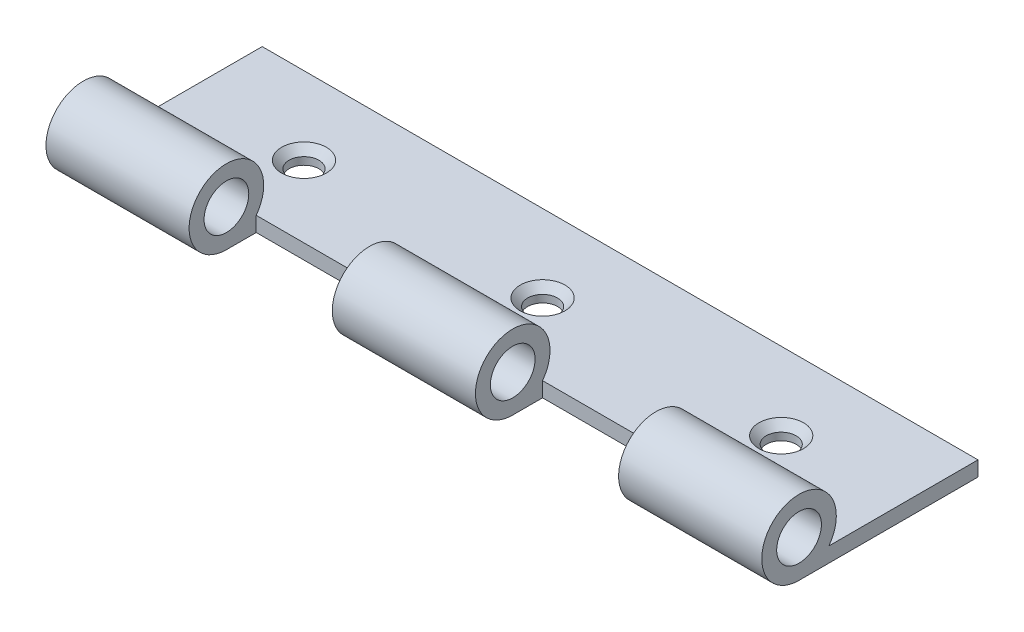
ISO-10303-21;
HEADER;
FILE_DESCRIPTION(('STEP AP214'),'2;1');
FILE_NAME('part.step','',(''),(''),'','','');
FILE_SCHEMA(('AUTOMOTIVE_DESIGN { 1 0 10303 214 1 1 1 1 }'));
ENDSEC;
DATA;
#1=APPLICATION_CONTEXT('core data for automotive mechanical design processes');
#2=APPLICATION_PROTOCOL_DEFINITION('international standard','automotive_design',2000,#1);
#3=PRODUCT_CONTEXT('',#1,'mechanical');
#4=PRODUCT('Part','Part','',(#3));
#5=PRODUCT_RELATED_PRODUCT_CATEGORY('part','',(#4));
#6=PRODUCT_DEFINITION_FORMATION('','',#4);
#7=PRODUCT_DEFINITION_CONTEXT('part definition',#1,'design');
#8=PRODUCT_DEFINITION('design','',#6,#7);
#9=PRODUCT_DEFINITION_SHAPE('','',#8);
#10=(LENGTH_UNIT() NAMED_UNIT(*) SI_UNIT(.MILLI.,.METRE.));
#11=(NAMED_UNIT(*) PLANE_ANGLE_UNIT() SI_UNIT($,.RADIAN.));
#12=(NAMED_UNIT(*) SI_UNIT($,.STERADIAN.) SOLID_ANGLE_UNIT());
#13=UNCERTAINTY_MEASURE_WITH_UNIT(LENGTH_MEASURE(1.E-05),#10,'distance_accuracy_value','');
#14=(GEOMETRIC_REPRESENTATION_CONTEXT(3) GLOBAL_UNCERTAINTY_ASSIGNED_CONTEXT((#13)) GLOBAL_UNIT_ASSIGNED_CONTEXT((#10,
#11,#12)) REPRESENTATION_CONTEXT('',''));
#15=CARTESIAN_POINT('',(0.,0.,0.));
#16=DIRECTION('',(0.,0.,1.));
#17=DIRECTION('',(1.,0.,0.));
#18=AXIS2_PLACEMENT_3D('',#15,#16,#17);
#19=CARTESIAN_POINT('',(0.,0.,0.));
#20=DIRECTION('',(0.,-1.,0.));
#21=DIRECTION('',(0.,0.,-1.));
#22=AXIS2_PLACEMENT_3D('',#19,#20,#21);
#23=PLANE('',#22);
#24=CARTESIAN_POINT('',(0.,0.,-1.275));
#25=DIRECTION('',(0.,1.,0.));
#26=DIRECTION('',(0.,0.,1.));
#27=AXIS2_PLACEMENT_3D('',#24,#25,#26);
#28=CIRCLE('',#27,1.5875);
#29=CARTESIAN_POINT('',(0.,0.,0.312500000000003));
#30=VERTEX_POINT('',#29);
#31=EDGE_CURVE('E185',#30,#30,#28,.T.);
#32=ORIENTED_EDGE('',*,*,#31,.T.);
#33=EDGE_LOOP('',(#32));
#34=FACE_BOUND('',#33,.T.);
#35=CARTESIAN_POINT('',(-25.4,0.,-1.275));
#36=DIRECTION('',(0.,1.,0.));
#37=DIRECTION('',(0.,0.,1.));
#38=AXIS2_PLACEMENT_3D('',#35,#36,#37);
#39=CIRCLE('',#38,1.5875);
#40=CARTESIAN_POINT('',(-25.4,0.,0.312500000000003));
#41=VERTEX_POINT('',#40);
#42=EDGE_CURVE('E178',#41,#41,#39,.T.);
#43=ORIENTED_EDGE('',*,*,#42,.T.);
#44=EDGE_LOOP('',(#43));
#45=FACE_BOUND('',#44,.T.);
#46=CARTESIAN_POINT('',(25.4,0.,-1.275));
#47=DIRECTION('',(0.,1.,0.));
#48=DIRECTION('',(0.,0.,1.));
#49=AXIS2_PLACEMENT_3D('',#46,#47,#48);
#50=CIRCLE('',#49,1.5875);
#51=CARTESIAN_POINT('',(25.4,0.,0.312500000000003));
#52=VERTEX_POINT('',#51);
#53=EDGE_CURVE('E45',#52,#52,#50,.T.);
#54=ORIENTED_EDGE('',*,*,#53,.T.);
#55=EDGE_LOOP('',(#54));
#56=FACE_BOUND('',#55,.T.);
#57=DIRECTION('',(1.,0.,0.));
#58=VECTOR('',#57,1.);
#59=CARTESIAN_POINT('',(-22.86,0.,6.35));
#60=LINE('',#59,#58);
#61=CARTESIAN_POINT('',(-22.86,0.,6.35));
#62=VERTEX_POINT('',#61);
#63=CARTESIAN_POINT('',(-7.61999999999998,0.,6.35));
#64=VERTEX_POINT('',#63);
#65=EDGE_CURVE('E135',#62,#64,#60,.T.);
#66=ORIENTED_EDGE('',*,*,#65,.F.);
#67=DIRECTION('',(0.,0.,-1.));
#68=VECTOR('',#67,1.);
#69=CARTESIAN_POINT('',(-22.86,0.,9.525));
#70=LINE('',#69,#68);
#71=CARTESIAN_POINT('',(-22.86,0.,9.525));
#72=VERTEX_POINT('',#71);
#73=EDGE_CURVE('E120',#72,#62,#70,.T.);
#74=ORIENTED_EDGE('',*,*,#73,.F.);
#75=DIRECTION('',(1.,0.,0.));
#76=VECTOR('',#75,1.);
#77=CARTESIAN_POINT('',(-38.1,0.,9.525));
#78=LINE('',#77,#76);
#79=CARTESIAN_POINT('',(-38.1,0.,9.525));
#80=VERTEX_POINT('',#79);
#81=EDGE_CURVE('E132',#80,#72,#78,.T.);
#82=ORIENTED_EDGE('',*,*,#81,.F.);
#83=DIRECTION('',(0.,0.,1.));
#84=VECTOR('',#83,1.);
#85=CARTESIAN_POINT('',(-38.1,0.,9.525));
#86=LINE('',#85,#84);
#87=CARTESIAN_POINT('',(-38.1,0.,-9.525));
#88=VERTEX_POINT('',#87);
#89=EDGE_CURVE('E148',#88,#80,#86,.T.);
#90=ORIENTED_EDGE('',*,*,#89,.F.);
#91=DIRECTION('',(-1.,0.,0.));
#92=VECTOR('',#91,1.);
#93=CARTESIAN_POINT('',(-38.1,0.,-9.525));
#94=LINE('',#93,#92);
#95=CARTESIAN_POINT('',(38.1,0.,-9.525));
#96=VERTEX_POINT('',#95);
#97=EDGE_CURVE('E153',#96,#88,#94,.T.);
#98=ORIENTED_EDGE('',*,*,#97,.F.);
#99=DIRECTION('',(0.,0.,-1.));
#100=VECTOR('',#99,1.);
#101=CARTESIAN_POINT('',(38.1,0.,9.525));
#102=LINE('',#101,#100);
#103=CARTESIAN_POINT('',(38.1,0.,9.525));
#104=VERTEX_POINT('',#103);
#105=EDGE_CURVE('E156',#104,#96,#102,.T.);
#106=ORIENTED_EDGE('',*,*,#105,.F.);
#107=CARTESIAN_POINT('',(22.86,0.,9.525));
#108=VERTEX_POINT('',#107);
#109=EDGE_CURVE('E143',#108,#104,#78,.T.);
#110=ORIENTED_EDGE('',*,*,#109,.F.);
#111=DIRECTION('',(0.,0.,-1.));
#112=VECTOR('',#111,1.);
#113=CARTESIAN_POINT('',(22.86,0.,9.525));
#114=LINE('',#113,#112);
#115=CARTESIAN_POINT('',(22.86,0.,6.35));
#116=VERTEX_POINT('',#115);
#117=EDGE_CURVE('E61',#108,#116,#114,.T.);
#118=ORIENTED_EDGE('',*,*,#117,.T.);
#119=DIRECTION('',(1.,0.,0.));
#120=VECTOR('',#119,1.);
#121=CARTESIAN_POINT('',(7.62000000000002,0.,6.35));
#122=LINE('',#121,#120);
#123=CARTESIAN_POINT('',(7.62000000000002,0.,6.35));
#124=VERTEX_POINT('',#123);
#125=EDGE_CURVE('E191',#124,#116,#122,.T.);
#126=ORIENTED_EDGE('',*,*,#125,.F.);
#127=DIRECTION('',(0.,0.,-1.));
#128=VECTOR('',#127,1.);
#129=CARTESIAN_POINT('',(7.62000000000002,0.,9.525));
#130=LINE('',#129,#128);
#131=CARTESIAN_POINT('',(7.62000000000002,0.,9.525));
#132=VERTEX_POINT('',#131);
#133=EDGE_CURVE('E208',#132,#124,#130,.T.);
#134=ORIENTED_EDGE('',*,*,#133,.F.);
#135=CARTESIAN_POINT('',(-7.61999999999998,0.,9.525));
#136=VERTEX_POINT('',#135);
#137=EDGE_CURVE('E141',#136,#132,#78,.T.);
#138=ORIENTED_EDGE('',*,*,#137,.F.);
#139=DIRECTION('',(0.,0.,-1.));
#140=VECTOR('',#139,1.);
#141=CARTESIAN_POINT('',(-7.61999999999998,0.,9.525));
#142=LINE('',#141,#140);
#143=EDGE_CURVE('E222',#136,#64,#142,.T.);
#144=ORIENTED_EDGE('',*,*,#143,.T.);
#145=EDGE_LOOP('',(#66,#74,#82,#90,#98,#106,#110,#118,#126,#134,#138,#144));
#146=FACE_BOUND('',#145,.T.);
#147=ADVANCED_FACE('F35',(#34,#45,#56,#146),#23,.T.);
#148=CARTESIAN_POINT('',(-49.3253201513364,3.96875,9.525));
#149=DIRECTION('',(1.,0.,0.));
#150=DIRECTION('',(0.,0.,-1.));
#151=AXIS2_PLACEMENT_3D('',#148,#149,#150);
#152=CYLINDRICAL_SURFACE('',#151,3.96875);
#153=ORIENTED_EDGE('',*,*,#81,.T.);
#154=CARTESIAN_POINT('',(-22.86,3.96875,9.525));
#155=DIRECTION('',(1.,0.,0.));
#156=DIRECTION('',(0.,0.,-1.));
#157=AXIS2_PLACEMENT_3D('',#154,#155,#156);
#158=CIRCLE('',#157,3.96875);
#159=CARTESIAN_POINT('',(-22.86,1.5875,6.35));
#160=VERTEX_POINT('',#159);
#161=EDGE_CURVE('E116',#160,#72,#158,.T.);
#162=ORIENTED_EDGE('',*,*,#161,.F.);
#163=DIRECTION('',(1.,0.,0.));
#164=VECTOR('',#163,1.);
#165=CARTESIAN_POINT('',(-49.3253201513364,1.5875,6.35));
#166=LINE('',#165,#164);
#167=CARTESIAN_POINT('',(-38.1,1.5875,6.35));
#168=VERTEX_POINT('',#167);
#169=EDGE_CURVE('E161',#168,#160,#166,.T.);
#170=ORIENTED_EDGE('',*,*,#169,.F.);
#171=CARTESIAN_POINT('',(-38.1,3.96875,9.525));
#172=DIRECTION('',(1.,0.,0.));
#173=DIRECTION('',(0.,0.,-1.));
#174=AXIS2_PLACEMENT_3D('',#171,#172,#173);
#175=CIRCLE('',#174,3.96875);
#176=EDGE_CURVE('E139',#80,#168,#175,.F.);
#177=ORIENTED_EDGE('',*,*,#176,.F.);
#178=EDGE_LOOP('',(#153,#162,#170,#177));
#179=FACE_BOUND('',#178,.T.);
#180=ADVANCED_FACE('F137',(#179),#152,.T.);
#181=CARTESIAN_POINT('',(-49.3253201513364,3.96875,9.525));
#182=DIRECTION('',(1.,0.,0.));
#183=DIRECTION('',(0.,0.,-1.));
#184=AXIS2_PLACEMENT_3D('',#181,#182,#183);
#185=CYLINDRICAL_SURFACE('',#184,2.38125);
#186=CARTESIAN_POINT('',(-38.1,3.96875,9.525));
#187=DIRECTION('',(1.,0.,0.));
#188=DIRECTION('',(0.,0.,-1.));
#189=AXIS2_PLACEMENT_3D('',#186,#187,#188);
#190=CIRCLE('',#189,2.38125);
#191=CARTESIAN_POINT('',(-38.1,3.96875,7.14375));
#192=VERTEX_POINT('',#191);
#193=EDGE_CURVE('E169',#192,#192,#190,.F.);
#194=ORIENTED_EDGE('',*,*,#193,.T.);
#195=EDGE_LOOP('',(#194));
#196=FACE_BOUND('',#195,.T.);
#197=CARTESIAN_POINT('',(-22.86,3.96875,9.525));
#198=DIRECTION('',(1.,0.,0.));
#199=DIRECTION('',(0.,0.,-1.));
#200=AXIS2_PLACEMENT_3D('',#197,#198,#199);
#201=CIRCLE('',#200,2.38125);
#202=CARTESIAN_POINT('',(-22.86,3.96875,7.14375));
#203=VERTEX_POINT('',#202);
#204=EDGE_CURVE('E205',#203,#203,#201,.F.);
#205=ORIENTED_EDGE('',*,*,#204,.F.);
#206=EDGE_LOOP('',(#205));
#207=FACE_BOUND('',#206,.T.);
#208=ADVANCED_FACE('F259',(#196,#207),#185,.F.);
#209=CARTESIAN_POINT('',(-7.61999999999998,3.96875,9.525));
#210=DIRECTION('',(1.,0.,0.));
#211=DIRECTION('',(0.,0.,-1.));
#212=AXIS2_PLACEMENT_3D('',#209,#210,#211);
#213=CIRCLE('',#212,3.96875);
#214=CARTESIAN_POINT('',(-7.61999999999998,1.5875,6.35));
#215=VERTEX_POINT('',#214);
#216=EDGE_CURVE('E224',#215,#136,#213,.T.);
#217=ORIENTED_EDGE('',*,*,#216,.T.);
#218=ORIENTED_EDGE('',*,*,#137,.T.);
#219=CARTESIAN_POINT('',(7.62000000000002,3.96875,9.525));
#220=DIRECTION('',(1.,0.,0.));
#221=DIRECTION('',(0.,0.,-1.));
#222=AXIS2_PLACEMENT_3D('',#219,#220,#221);
#223=CIRCLE('',#222,3.96875);
#224=CARTESIAN_POINT('',(7.62000000000002,1.5875,6.35));
#225=VERTEX_POINT('',#224);
#226=EDGE_CURVE('E201',#225,#132,#223,.T.);
#227=ORIENTED_EDGE('',*,*,#226,.F.);
#228=EDGE_CURVE('E167',#215,#225,#166,.T.);
#229=ORIENTED_EDGE('',*,*,#228,.F.);
#230=EDGE_LOOP('',(#217,#218,#227,#229));
#231=FACE_BOUND('',#230,.T.);
#232=ADVANCED_FACE('F230',(#231),#152,.T.);
#233=CARTESIAN_POINT('',(-7.61999999999998,3.96875,9.525));
#234=DIRECTION('',(1.,0.,0.));
#235=DIRECTION('',(0.,0.,-1.));
#236=AXIS2_PLACEMENT_3D('',#233,#234,#235);
#237=CIRCLE('',#236,2.38125);
#238=CARTESIAN_POINT('',(-7.61999999999998,3.96875,7.14375));
#239=VERTEX_POINT('',#238);
#240=EDGE_CURVE('E214',#239,#239,#237,.F.);
#241=ORIENTED_EDGE('',*,*,#240,.T.);
#242=EDGE_LOOP('',(#241));
#243=FACE_BOUND('',#242,.T.);
#244=CARTESIAN_POINT('',(7.62000000000002,3.96875,9.525));
#245=DIRECTION('',(1.,0.,0.));
#246=DIRECTION('',(0.,0.,-1.));
#247=AXIS2_PLACEMENT_3D('',#244,#245,#246);
#248=CIRCLE('',#247,2.38125);
#249=CARTESIAN_POINT('',(7.62000000000002,3.96875,7.14375));
#250=VERTEX_POINT('',#249);
#251=EDGE_CURVE('E40',#250,#250,#248,.F.);
#252=ORIENTED_EDGE('',*,*,#251,.F.);
#253=EDGE_LOOP('',(#252));
#254=FACE_BOUND('',#253,.T.);
#255=ADVANCED_FACE('F254',(#243,#254),#185,.F.);
#256=CARTESIAN_POINT('',(25.4,0.793750000000011,-1.275));
#257=DIRECTION('',(0.,1.,0.));
#258=DIRECTION('',(0.,0.,1.));
#259=AXIS2_PLACEMENT_3D('',#256,#257,#258);
#260=CONICAL_SURFACE('',#259,1.5875,0.785398163397448);
#261=CARTESIAN_POINT('',(25.4,1.5875,-1.275));
#262=DIRECTION('',(0.,-1.,0.));
#263=DIRECTION('',(0.,0.,-1.));
#264=AXIS2_PLACEMENT_3D('',#261,#262,#263);
#265=CIRCLE('',#264,2.38124999999999);
#266=CARTESIAN_POINT('',(25.4,1.5875,-3.65624999999998));
#267=VERTEX_POINT('',#266);
#268=EDGE_CURVE('E268',#267,#267,#265,.T.);
#269=ORIENTED_EDGE('',*,*,#268,.F.);
#270=EDGE_LOOP('',(#269));
#271=FACE_BOUND('',#270,.T.);
#272=CARTESIAN_POINT('',(25.4,0.793750000000011,-1.275));
#273=DIRECTION('',(0.,-1.,0.));
#274=DIRECTION('',(0.,0.,-1.));
#275=AXIS2_PLACEMENT_3D('',#272,#273,#274);
#276=CIRCLE('',#275,1.5875);
#277=CARTESIAN_POINT('',(25.4,0.793750000000011,-2.86249999999999));
#278=VERTEX_POINT('',#277);
#279=EDGE_CURVE('E11',#278,#278,#276,.F.);
#280=ORIENTED_EDGE('',*,*,#279,.F.);
#281=EDGE_LOOP('',(#280));
#282=FACE_BOUND('',#281,.T.);
#283=ADVANCED_FACE('F38',(#271,#282),#260,.F.);
#284=CARTESIAN_POINT('',(25.4,0.,-1.275));
#285=DIRECTION('',(0.,1.,0.));
#286=DIRECTION('',(0.,0.,1.));
#287=AXIS2_PLACEMENT_3D('',#284,#285,#286);
#288=CYLINDRICAL_SURFACE('',#287,1.5875);
#289=ORIENTED_EDGE('',*,*,#279,.T.);
#290=EDGE_LOOP('',(#289));
#291=FACE_BOUND('',#290,.T.);
#292=ORIENTED_EDGE('',*,*,#53,.F.);
#293=EDGE_LOOP('',(#292));
#294=FACE_BOUND('',#293,.T.);
#295=ADVANCED_FACE('F318',(#291,#294),#288,.F.);
#296=CARTESIAN_POINT('',(38.1,1.5875,9.525));
#297=DIRECTION('',(-1.,0.,0.));
#298=DIRECTION('',(0.,0.,1.));
#299=AXIS2_PLACEMENT_3D('',#296,#297,#298);
#300=PLANE('',#299);
#301=DIRECTION('',(0.,0.,-1.));
#302=VECTOR('',#301,1.);
#303=CARTESIAN_POINT('',(38.1,1.5875,9.525));
#304=LINE('',#303,#302);
#305=CARTESIAN_POINT('',(38.1,1.5875,6.35));
#306=VERTEX_POINT('',#305);
#307=CARTESIAN_POINT('',(38.1,1.5875,-9.525));
#308=VERTEX_POINT('',#307);
#309=EDGE_CURVE('E140',#306,#308,#304,.T.);
#310=ORIENTED_EDGE('',*,*,#309,.F.);
#311=CARTESIAN_POINT('',(38.1,3.96875,9.525));
#312=DIRECTION('',(1.,0.,0.));
#313=DIRECTION('',(0.,0.,-1.));
#314=AXIS2_PLACEMENT_3D('',#311,#312,#313);
#315=CIRCLE('',#314,3.96875);
#316=EDGE_CURVE('E172',#306,#104,#315,.T.);
#317=ORIENTED_EDGE('',*,*,#316,.T.);
#318=ORIENTED_EDGE('',*,*,#105,.T.);
#319=DIRECTION('',(0.,-1.,0.));
#320=VECTOR('',#319,1.);
#321=CARTESIAN_POINT('',(38.1,1.5875,-9.525));
#322=LINE('',#321,#320);
#323=EDGE_CURVE('E277',#308,#96,#322,.T.);
#324=ORIENTED_EDGE('',*,*,#323,.F.);
#325=EDGE_LOOP('',(#310,#317,#318,#324));
#326=FACE_BOUND('',#325,.T.);
#327=CARTESIAN_POINT('',(38.1,3.96875,9.525));
#328=DIRECTION('',(1.,0.,0.));
#329=DIRECTION('',(0.,0.,-1.));
#330=AXIS2_PLACEMENT_3D('',#327,#328,#329);
#331=CIRCLE('',#330,2.38125);
#332=CARTESIAN_POINT('',(38.1,3.96875,7.14375));
#333=VERTEX_POINT('',#332);
#334=EDGE_CURVE('E175',#333,#333,#331,.T.);
#335=ORIENTED_EDGE('',*,*,#334,.F.);
#336=EDGE_LOOP('',(#335));
#337=FACE_BOUND('',#336,.T.);
#338=ADVANCED_FACE('F288',(#326,#337),#300,.F.);
#339=CARTESIAN_POINT('',(-38.1,1.5875,-9.525));
#340=DIRECTION('',(0.,0.,1.));
#341=DIRECTION('',(1.,0.,0.));
#342=AXIS2_PLACEMENT_3D('',#339,#340,#341);
#343=PLANE('',#342);
#344=ORIENTED_EDGE('',*,*,#97,.T.);
#345=DIRECTION('',(0.,-1.,0.));
#346=VECTOR('',#345,1.);
#347=CARTESIAN_POINT('',(-38.1,1.5875,-9.525));
#348=LINE('',#347,#346);
#349=CARTESIAN_POINT('',(-38.1,1.5875,-9.525));
#350=VERTEX_POINT('',#349);
#351=EDGE_CURVE('E164',#350,#88,#348,.T.);
#352=ORIENTED_EDGE('',*,*,#351,.F.);
#353=DIRECTION('',(-1.,0.,0.));
#354=VECTOR('',#353,1.);
#355=CARTESIAN_POINT('',(-38.1,1.5875,-9.525));
#356=LINE('',#355,#354);
#357=EDGE_CURVE('E144',#308,#350,#356,.T.);
#358=ORIENTED_EDGE('',*,*,#357,.F.);
#359=ORIENTED_EDGE('',*,*,#323,.T.);
#360=EDGE_LOOP('',(#344,#352,#358,#359));
#361=FACE_BOUND('',#360,.T.);
#362=ADVANCED_FACE('F286',(#361),#343,.F.);
#363=CARTESIAN_POINT('',(-38.1,1.5875,9.525));
#364=DIRECTION('',(1.,0.,0.));
#365=DIRECTION('',(0.,0.,-1.));
#366=AXIS2_PLACEMENT_3D('',#363,#364,#365);
#367=PLANE('',#366);
#368=ORIENTED_EDGE('',*,*,#89,.T.);
#369=ORIENTED_EDGE('',*,*,#176,.T.);
#370=DIRECTION('',(0.,0.,1.));
#371=VECTOR('',#370,1.);
#372=CARTESIAN_POINT('',(-38.1,1.5875,9.525));
#373=LINE('',#372,#371);
#374=EDGE_CURVE('E162',#350,#168,#373,.T.);
#375=ORIENTED_EDGE('',*,*,#374,.F.);
#376=ORIENTED_EDGE('',*,*,#351,.T.);
#377=EDGE_LOOP('',(#368,#369,#375,#376));
#378=FACE_BOUND('',#377,.T.);
#379=ORIENTED_EDGE('',*,*,#193,.F.);
#380=EDGE_LOOP('',(#379));
#381=FACE_BOUND('',#380,.T.);
#382=ADVANCED_FACE('F281',(#378,#381),#367,.F.);
#383=CARTESIAN_POINT('',(0.,1.5875,0.));
#384=DIRECTION('',(0.,-1.,0.));
#385=DIRECTION('',(0.,0.,-1.));
#386=AXIS2_PLACEMENT_3D('',#383,#384,#385);
#387=PLANE('',#386);
#388=CARTESIAN_POINT('',(0.,1.5875,-1.275));
#389=DIRECTION('',(0.,-1.,0.));
#390=DIRECTION('',(0.,0.,-1.));
#391=AXIS2_PLACEMENT_3D('',#388,#389,#390);
#392=CIRCLE('',#391,2.38124999999999);
#393=CARTESIAN_POINT('',(0.,1.5875,-3.65624999999998));
#394=VERTEX_POINT('',#393);
#395=EDGE_CURVE('E188',#394,#394,#392,.T.);
#396=ORIENTED_EDGE('',*,*,#395,.T.);
#397=EDGE_LOOP('',(#396));
#398=FACE_BOUND('',#397,.T.);
#399=CARTESIAN_POINT('',(-25.4,1.5875,-1.275));
#400=DIRECTION('',(0.,-1.,0.));
#401=DIRECTION('',(0.,0.,-1.));
#402=AXIS2_PLACEMENT_3D('',#399,#400,#401);
#403=CIRCLE('',#402,2.38124999999999);
#404=CARTESIAN_POINT('',(-25.4,1.5875,-3.65624999999998));
#405=VERTEX_POINT('',#404);
#406=EDGE_CURVE('E271',#405,#405,#403,.T.);
#407=ORIENTED_EDGE('',*,*,#406,.T.);
#408=EDGE_LOOP('',(#407));
#409=FACE_BOUND('',#408,.T.);
#410=ORIENTED_EDGE('',*,*,#374,.T.);
#411=ORIENTED_EDGE('',*,*,#169,.T.);
#412=DIRECTION('',(1.,0.,0.));
#413=VECTOR('',#412,1.);
#414=CARTESIAN_POINT('',(-22.86,1.5875,6.35));
#415=LINE('',#414,#413);
#416=EDGE_CURVE('E217',#160,#215,#415,.T.);
#417=ORIENTED_EDGE('',*,*,#416,.T.);
#418=ORIENTED_EDGE('',*,*,#228,.T.);
#419=DIRECTION('',(1.,0.,0.));
#420=VECTOR('',#419,1.);
#421=CARTESIAN_POINT('',(7.62000000000002,1.5875,6.35));
#422=LINE('',#421,#420);
#423=CARTESIAN_POINT('',(22.86,1.5875,6.35));
#424=VERTEX_POINT('',#423);
#425=EDGE_CURVE('E193',#225,#424,#422,.T.);
#426=ORIENTED_EDGE('',*,*,#425,.T.);
#427=EDGE_CURVE('E168',#424,#306,#166,.T.);
#428=ORIENTED_EDGE('',*,*,#427,.T.);
#429=ORIENTED_EDGE('',*,*,#309,.T.);
#430=ORIENTED_EDGE('',*,*,#357,.T.);
#431=EDGE_LOOP('',(#410,#411,#417,#418,#426,#428,#429,#430));
#432=FACE_BOUND('',#431,.T.);
#433=ORIENTED_EDGE('',*,*,#268,.T.);
#434=EDGE_LOOP('',(#433));
#435=FACE_BOUND('',#434,.T.);
#436=ADVANCED_FACE('F244',(#398,#409,#432,#435),#387,.F.);
#437=CARTESIAN_POINT('',(22.86,3.96875,9.525));
#438=DIRECTION('',(1.,0.,0.));
#439=DIRECTION('',(0.,0.,-1.));
#440=AXIS2_PLACEMENT_3D('',#437,#438,#439);
#441=CIRCLE('',#440,3.96875);
#442=EDGE_CURVE('E203',#424,#108,#441,.T.);
#443=ORIENTED_EDGE('',*,*,#442,.T.);
#444=ORIENTED_EDGE('',*,*,#109,.T.);
#445=ORIENTED_EDGE('',*,*,#316,.F.);
#446=ORIENTED_EDGE('',*,*,#427,.F.);
#447=EDGE_LOOP('',(#443,#444,#445,#446));
#448=FACE_BOUND('',#447,.T.);
#449=ADVANCED_FACE('F290',(#448),#152,.T.);
#450=CARTESIAN_POINT('',(22.86,3.96875,9.525));
#451=DIRECTION('',(1.,0.,0.));
#452=DIRECTION('',(0.,0.,-1.));
#453=AXIS2_PLACEMENT_3D('',#450,#451,#452);
#454=CIRCLE('',#453,2.38125);
#455=CARTESIAN_POINT('',(22.86,3.96875,7.14375));
#456=VERTEX_POINT('',#455);
#457=EDGE_CURVE('E197',#456,#456,#454,.F.);
#458=ORIENTED_EDGE('',*,*,#457,.T.);
#459=EDGE_LOOP('',(#458));
#460=FACE_BOUND('',#459,.T.);
#461=ORIENTED_EDGE('',*,*,#334,.T.);
#462=EDGE_LOOP('',(#461));
#463=FACE_BOUND('',#462,.T.);
#464=ADVANCED_FACE('F258',(#460,#463),#185,.F.);
#465=CARTESIAN_POINT('',(-25.4,0.,-1.275));
#466=DIRECTION('',(0.,1.,0.));
#467=DIRECTION('',(0.,0.,1.));
#468=AXIS2_PLACEMENT_3D('',#465,#466,#467);
#469=CYLINDRICAL_SURFACE('',#468,1.5875);
#470=CARTESIAN_POINT('',(-25.4,0.793750000000011,-1.275));
#471=DIRECTION('',(0.,-1.,0.));
#472=DIRECTION('',(0.,0.,-1.));
#473=AXIS2_PLACEMENT_3D('',#470,#471,#472);
#474=CIRCLE('',#473,1.5875);
#475=CARTESIAN_POINT('',(-25.4,0.793750000000011,-2.86249999999999));
#476=VERTEX_POINT('',#475);
#477=EDGE_CURVE('E274',#476,#476,#474,.F.);
#478=ORIENTED_EDGE('',*,*,#477,.T.);
#479=EDGE_LOOP('',(#478));
#480=FACE_BOUND('',#479,.T.);
#481=ORIENTED_EDGE('',*,*,#42,.F.);
#482=EDGE_LOOP('',(#481));
#483=FACE_BOUND('',#482,.T.);
#484=ADVANCED_FACE('F326',(#480,#483),#469,.F.);
#485=CARTESIAN_POINT('',(-25.4,0.793750000000011,-1.275));
#486=DIRECTION('',(0.,1.,0.));
#487=DIRECTION('',(0.,0.,1.));
#488=AXIS2_PLACEMENT_3D('',#485,#486,#487);
#489=CONICAL_SURFACE('',#488,1.5875,0.785398163397448);
#490=ORIENTED_EDGE('',*,*,#406,.F.);
#491=EDGE_LOOP('',(#490));
#492=FACE_BOUND('',#491,.T.);
#493=ORIENTED_EDGE('',*,*,#477,.F.);
#494=EDGE_LOOP('',(#493));
#495=FACE_BOUND('',#494,.T.);
#496=ADVANCED_FACE('F320',(#492,#495),#489,.F.);
#497=CARTESIAN_POINT('',(0.,0.,-1.275));
#498=DIRECTION('',(0.,1.,0.));
#499=DIRECTION('',(0.,0.,1.));
#500=AXIS2_PLACEMENT_3D('',#497,#498,#499);
#501=CYLINDRICAL_SURFACE('',#500,1.5875);
#502=CARTESIAN_POINT('',(0.,0.793750000000011,-1.275));
#503=DIRECTION('',(0.,-1.,0.));
#504=DIRECTION('',(0.,0.,-1.));
#505=AXIS2_PLACEMENT_3D('',#502,#503,#504);
#506=CIRCLE('',#505,1.5875);
#507=CARTESIAN_POINT('',(0.,0.793750000000011,-2.86249999999999));
#508=VERTEX_POINT('',#507);
#509=EDGE_CURVE('E182',#508,#508,#506,.F.);
#510=ORIENTED_EDGE('',*,*,#509,.T.);
#511=EDGE_LOOP('',(#510));
#512=FACE_BOUND('',#511,.T.);
#513=ORIENTED_EDGE('',*,*,#31,.F.);
#514=EDGE_LOOP('',(#513));
#515=FACE_BOUND('',#514,.T.);
#516=ADVANCED_FACE('F325',(#512,#515),#501,.F.);
#517=CARTESIAN_POINT('',(0.,0.793750000000011,-1.275));
#518=DIRECTION('',(0.,1.,0.));
#519=DIRECTION('',(0.,0.,1.));
#520=AXIS2_PLACEMENT_3D('',#517,#518,#519);
#521=CONICAL_SURFACE('',#520,1.5875,0.785398163397448);
#522=ORIENTED_EDGE('',*,*,#395,.F.);
#523=EDGE_LOOP('',(#522));
#524=FACE_BOUND('',#523,.T.);
#525=ORIENTED_EDGE('',*,*,#509,.F.);
#526=EDGE_LOOP('',(#525));
#527=FACE_BOUND('',#526,.T.);
#528=ADVANCED_FACE('F300',(#524,#527),#521,.F.);
#529=CARTESIAN_POINT('',(7.62000000000002,3.96875,9.525));
#530=DIRECTION('',(1.,0.,0.));
#531=DIRECTION('',(0.,0.,-1.));
#532=AXIS2_PLACEMENT_3D('',#529,#530,#531);
#533=PLANE('',#532);
#534=ORIENTED_EDGE('',*,*,#226,.T.);
#535=ORIENTED_EDGE('',*,*,#133,.T.);
#536=DIRECTION('',(0.,1.,0.));
#537=VECTOR('',#536,1.);
#538=CARTESIAN_POINT('',(7.62000000000002,1.5875,6.35));
#539=LINE('',#538,#537);
#540=EDGE_CURVE('E194',#124,#225,#539,.T.);
#541=ORIENTED_EDGE('',*,*,#540,.T.);
#542=EDGE_LOOP('',(#534,#535,#541));
#543=FACE_BOUND('',#542,.T.);
#544=ORIENTED_EDGE('',*,*,#251,.T.);
#545=EDGE_LOOP('',(#544));
#546=FACE_BOUND('',#545,.T.);
#547=ADVANCED_FACE('F237',(#543,#546),#533,.T.);
#548=CARTESIAN_POINT('',(22.86,3.96875,9.525));
#549=DIRECTION('',(1.,0.,0.));
#550=DIRECTION('',(0.,0.,-1.));
#551=AXIS2_PLACEMENT_3D('',#548,#549,#550);
#552=PLANE('',#551);
#553=ORIENTED_EDGE('',*,*,#442,.F.);
#554=DIRECTION('',(0.,1.,0.));
#555=VECTOR('',#554,1.);
#556=CARTESIAN_POINT('',(22.86,1.5875,6.35));
#557=LINE('',#556,#555);
#558=EDGE_CURVE('E198',#116,#424,#557,.T.);
#559=ORIENTED_EDGE('',*,*,#558,.F.);
#560=ORIENTED_EDGE('',*,*,#117,.F.);
#561=EDGE_LOOP('',(#553,#559,#560));
#562=FACE_BOUND('',#561,.T.);
#563=ORIENTED_EDGE('',*,*,#457,.F.);
#564=EDGE_LOOP('',(#563));
#565=FACE_BOUND('',#564,.T.);
#566=ADVANCED_FACE('F291',(#562,#565),#552,.F.);
#567=CARTESIAN_POINT('',(7.62000000000002,1.5875,6.35));
#568=DIRECTION('',(0.,0.,-1.));
#569=DIRECTION('',(0.,1.,0.));
#570=AXIS2_PLACEMENT_3D('',#567,#568,#569);
#571=PLANE('',#570);
#572=ORIENTED_EDGE('',*,*,#558,.T.);
#573=ORIENTED_EDGE('',*,*,#425,.F.);
#574=ORIENTED_EDGE('',*,*,#540,.F.);
#575=ORIENTED_EDGE('',*,*,#125,.T.);
#576=EDGE_LOOP('',(#572,#573,#574,#575));
#577=FACE_BOUND('',#576,.T.);
#578=ADVANCED_FACE('F241',(#577),#571,.F.);
#579=CARTESIAN_POINT('',(-22.86,3.96875,9.525));
#580=DIRECTION('',(1.,0.,0.));
#581=DIRECTION('',(0.,0.,-1.));
#582=AXIS2_PLACEMENT_3D('',#579,#580,#581);
#583=PLANE('',#582);
#584=ORIENTED_EDGE('',*,*,#161,.T.);
#585=ORIENTED_EDGE('',*,*,#73,.T.);
#586=DIRECTION('',(0.,1.,0.));
#587=VECTOR('',#586,1.);
#588=CARTESIAN_POINT('',(-22.86,1.5875,6.35));
#589=LINE('',#588,#587);
#590=EDGE_CURVE('E122',#62,#160,#589,.T.);
#591=ORIENTED_EDGE('',*,*,#590,.T.);
#592=EDGE_LOOP('',(#584,#585,#591));
#593=FACE_BOUND('',#592,.T.);
#594=ORIENTED_EDGE('',*,*,#204,.T.);
#595=EDGE_LOOP('',(#594));
#596=FACE_BOUND('',#595,.T.);
#597=ADVANCED_FACE('F118',(#593,#596),#583,.T.);
#598=CARTESIAN_POINT('',(-7.61999999999998,3.96875,9.525));
#599=DIRECTION('',(1.,0.,0.));
#600=DIRECTION('',(0.,0.,-1.));
#601=AXIS2_PLACEMENT_3D('',#598,#599,#600);
#602=PLANE('',#601);
#603=ORIENTED_EDGE('',*,*,#216,.F.);
#604=DIRECTION('',(0.,1.,0.));
#605=VECTOR('',#604,1.);
#606=CARTESIAN_POINT('',(-7.61999999999998,1.5875,6.35));
#607=LINE('',#606,#605);
#608=EDGE_CURVE('E53',#64,#215,#607,.T.);
#609=ORIENTED_EDGE('',*,*,#608,.F.);
#610=ORIENTED_EDGE('',*,*,#143,.F.);
#611=EDGE_LOOP('',(#603,#609,#610));
#612=FACE_BOUND('',#611,.T.);
#613=ORIENTED_EDGE('',*,*,#240,.F.);
#614=EDGE_LOOP('',(#613));
#615=FACE_BOUND('',#614,.T.);
#616=ADVANCED_FACE('F248',(#612,#615),#602,.F.);
#617=CARTESIAN_POINT('',(-22.86,1.5875,6.35));
#618=DIRECTION('',(0.,0.,-1.));
#619=DIRECTION('',(0.,1.,0.));
#620=AXIS2_PLACEMENT_3D('',#617,#618,#619);
#621=PLANE('',#620);
#622=ORIENTED_EDGE('',*,*,#608,.T.);
#623=ORIENTED_EDGE('',*,*,#416,.F.);
#624=ORIENTED_EDGE('',*,*,#590,.F.);
#625=ORIENTED_EDGE('',*,*,#65,.T.);
#626=EDGE_LOOP('',(#622,#623,#624,#625));
#627=FACE_BOUND('',#626,.T.);
#628=ADVANCED_FACE('F247',(#627),#621,.F.);
#629=CLOSED_SHELL('',(#147,#180,#208,#232,#255,#283,#295,#338,#362,#382,#436,#449,#464,#484,
#496,#516,#528,#547,#566,#578,#597,#616,#628));
#630=MANIFOLD_SOLID_BREP('B2',#629);
#631=ADVANCED_BREP_SHAPE_REPRESENTATION('',(#18,#630),#14);
#632=SHAPE_DEFINITION_REPRESENTATION(#9,#631);
ENDSEC;
END-ISO-10303-21;
